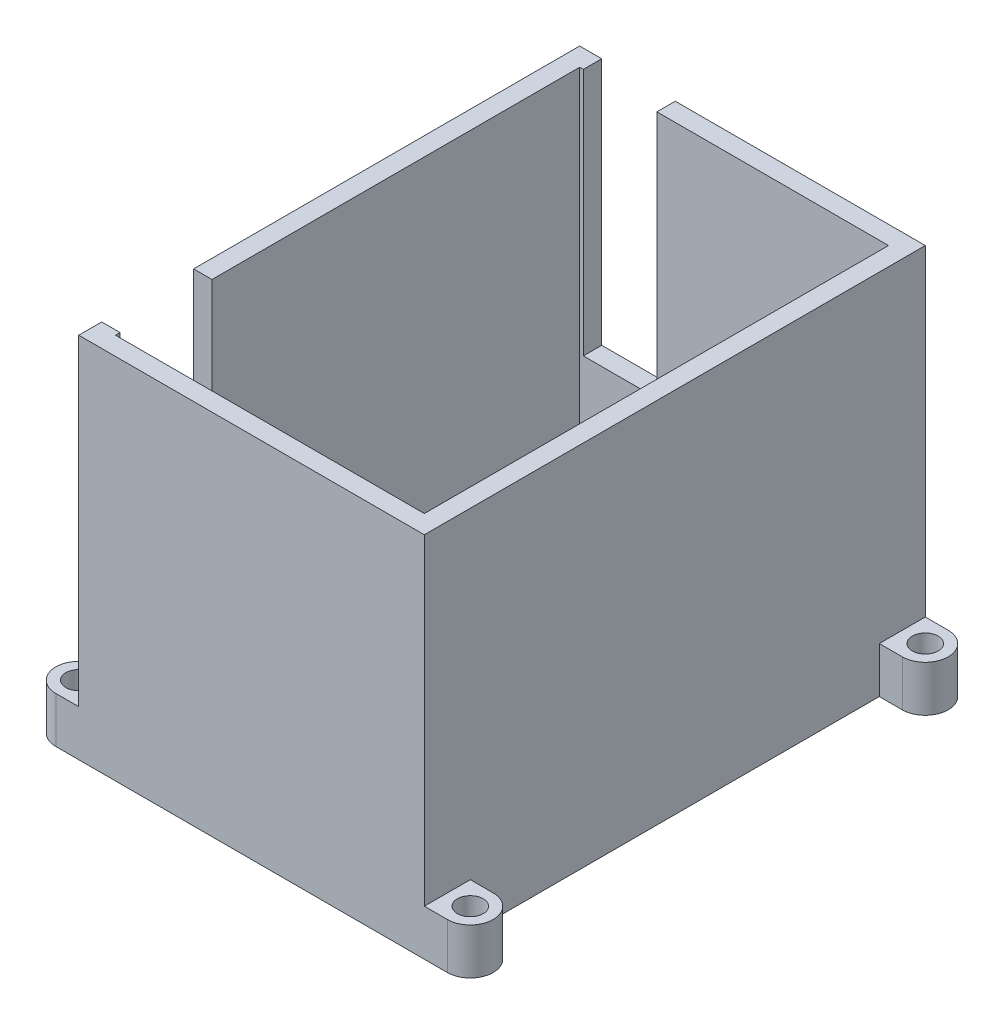
ISO-10303-21;
HEADER;
FILE_DESCRIPTION(('STEP AP214'),'2;1');
FILE_NAME('part.step','',(''),(''),'','','');
FILE_SCHEMA(('AUTOMOTIVE_DESIGN { 1 0 10303 214 1 1 1 1 }'));
ENDSEC;
DATA;
#1=APPLICATION_CONTEXT('core data for automotive mechanical design processes');
#2=APPLICATION_PROTOCOL_DEFINITION('international standard','automotive_design',2000,#1);
#3=PRODUCT_CONTEXT('',#1,'mechanical');
#4=PRODUCT('Part','Part','',(#3));
#5=PRODUCT_RELATED_PRODUCT_CATEGORY('part','',(#4));
#6=PRODUCT_DEFINITION_FORMATION('','',#4);
#7=PRODUCT_DEFINITION_CONTEXT('part definition',#1,'design');
#8=PRODUCT_DEFINITION('design','',#6,#7);
#9=PRODUCT_DEFINITION_SHAPE('','',#8);
#10=(LENGTH_UNIT() NAMED_UNIT(*) SI_UNIT(.MILLI.,.METRE.));
#11=(NAMED_UNIT(*) PLANE_ANGLE_UNIT() SI_UNIT($,.RADIAN.));
#12=(NAMED_UNIT(*) SI_UNIT($,.STERADIAN.) SOLID_ANGLE_UNIT());
#13=UNCERTAINTY_MEASURE_WITH_UNIT(LENGTH_MEASURE(1.E-05),#10,'distance_accuracy_value','');
#14=(GEOMETRIC_REPRESENTATION_CONTEXT(3) GLOBAL_UNCERTAINTY_ASSIGNED_CONTEXT((#13)) GLOBAL_UNIT_ASSIGNED_CONTEXT((#10,
#11,#12)) REPRESENTATION_CONTEXT('',''));
#15=CARTESIAN_POINT('',(0.,0.,0.));
#16=DIRECTION('',(0.,0.,1.));
#17=DIRECTION('',(1.,0.,0.));
#18=AXIS2_PLACEMENT_3D('',#15,#16,#17);
#19=CARTESIAN_POINT('',(0.,50.8,0.));
#20=DIRECTION('',(0.,1.,0.));
#21=DIRECTION('',(0.,0.,1.));
#22=AXIS2_PLACEMENT_3D('',#19,#20,#21);
#23=PLANE('',#22);
#24=DIRECTION('',(0.,0.,-1.));
#25=VECTOR('',#24,1.);
#26=CARTESIAN_POINT('',(0.508000000000002,50.8,-60.325));
#27=LINE('',#26,#25);
#28=CARTESIAN_POINT('',(0.508000000000002,50.8,-64.135));
#29=VERTEX_POINT('',#28);
#30=CARTESIAN_POINT('',(0.508000000000002,50.8,-66.675));
#31=VERTEX_POINT('',#30);
#32=EDGE_CURVE('E219',#29,#31,#27,.T.);
#33=ORIENTED_EDGE('',*,*,#32,.T.);
#34=DIRECTION('',(-1.,0.,0.));
#35=VECTOR('',#34,1.);
#36=CARTESIAN_POINT('',(-2.54,50.8,-66.675));
#37=LINE('',#36,#35);
#38=CARTESIAN_POINT('',(-2.54,50.8,-66.675));
#39=VERTEX_POINT('',#38);
#40=EDGE_CURVE('E232',#31,#39,#37,.T.);
#41=ORIENTED_EDGE('',*,*,#40,.T.);
#42=DIRECTION('',(0.,0.,1.));
#43=VECTOR('',#42,1.);
#44=CARTESIAN_POINT('',(-2.54,50.8,-66.675));
#45=LINE('',#44,#43);
#46=CARTESIAN_POINT('',(-2.53999999999999,50.8,-13.335));
#47=VERTEX_POINT('',#46);
#48=EDGE_CURVE('E497',#39,#47,#45,.T.);
#49=ORIENTED_EDGE('',*,*,#48,.T.);
#50=DIRECTION('',(-1.,0.,0.));
#51=VECTOR('',#50,1.);
#52=CARTESIAN_POINT('',(3.81000000000001,50.8,-13.335));
#53=LINE('',#52,#51);
#54=CARTESIAN_POINT('',(0.,50.8,-13.335));
#55=VERTEX_POINT('',#54);
#56=EDGE_CURVE('E521',#55,#47,#53,.T.);
#57=ORIENTED_EDGE('',*,*,#56,.F.);
#58=DIRECTION('',(0.,0.,1.));
#59=VECTOR('',#58,1.);
#60=CARTESIAN_POINT('',(0.,50.8,0.));
#61=LINE('',#60,#59);
#62=CARTESIAN_POINT('',(0.,50.8,-64.135));
#63=VERTEX_POINT('',#62);
#64=EDGE_CURVE('E612',#63,#55,#61,.T.);
#65=ORIENTED_EDGE('',*,*,#64,.F.);
#66=DIRECTION('',(-1.,0.,0.));
#67=VECTOR('',#66,1.);
#68=CARTESIAN_POINT('',(0.,50.8,-64.135));
#69=LINE('',#68,#67);
#70=EDGE_CURVE('E235',#29,#63,#69,.T.);
#71=ORIENTED_EDGE('',*,*,#70,.F.);
#72=EDGE_LOOP('',(#33,#41,#49,#57,#65,#71));
#73=FACE_BOUND('',#72,.T.);
#74=ADVANCED_FACE('F33',(#73),#23,.T.);
#75=CARTESIAN_POINT('',(45.212,50.8,-66.675));
#76=DIRECTION('',(-1.,0.,0.));
#77=DIRECTION('',(0.,0.,1.));
#78=AXIS2_PLACEMENT_3D('',#75,#76,#77);
#79=PLANE('',#78);
#80=DIRECTION('',(0.,0.,-1.));
#81=VECTOR('',#80,1.);
#82=CARTESIAN_POINT('',(45.212,6.35,-3.81000000000001));
#83=LINE('',#82,#81);
#84=CARTESIAN_POINT('',(45.212,6.34999999999999,2.54));
#85=VERTEX_POINT('',#84);
#86=CARTESIAN_POINT('',(45.212,6.35,-3.81000000000001));
#87=VERTEX_POINT('',#86);
#88=EDGE_CURVE('E405',#85,#87,#83,.T.);
#89=ORIENTED_EDGE('',*,*,#88,.T.);
#90=DIRECTION('',(0.,-1.,0.));
#91=VECTOR('',#90,1.);
#92=CARTESIAN_POINT('',(45.212,6.35,-3.81000000000001));
#93=LINE('',#92,#91);
#94=CARTESIAN_POINT('',(45.212,0.,-3.81000000000001));
#95=VERTEX_POINT('',#94);
#96=EDGE_CURVE('E403',#87,#95,#93,.T.);
#97=ORIENTED_EDGE('',*,*,#96,.T.);
#98=DIRECTION('',(0.,0.,-1.));
#99=VECTOR('',#98,1.);
#100=CARTESIAN_POINT('',(45.212,0.,-66.675));
#101=LINE('',#100,#99);
#102=CARTESIAN_POINT('',(45.212,0.,-60.325));
#103=VERTEX_POINT('',#102);
#104=EDGE_CURVE('E262',#95,#103,#101,.T.);
#105=ORIENTED_EDGE('',*,*,#104,.T.);
#106=DIRECTION('',(0.,-1.,0.));
#107=VECTOR('',#106,1.);
#108=CARTESIAN_POINT('',(45.212,6.35,-60.325));
#109=LINE('',#108,#107);
#110=CARTESIAN_POINT('',(45.212,6.35,-60.325));
#111=VERTEX_POINT('',#110);
#112=EDGE_CURVE('E294',#111,#103,#109,.T.);
#113=ORIENTED_EDGE('',*,*,#112,.F.);
#114=DIRECTION('',(0.,0.,-1.));
#115=VECTOR('',#114,1.);
#116=CARTESIAN_POINT('',(45.212,6.35,-60.325));
#117=LINE('',#116,#115);
#118=CARTESIAN_POINT('',(45.212,6.35,-66.675));
#119=VERTEX_POINT('',#118);
#120=EDGE_CURVE('E287',#111,#119,#117,.T.);
#121=ORIENTED_EDGE('',*,*,#120,.T.);
#122=DIRECTION('',(0.,-1.,0.));
#123=VECTOR('',#122,1.);
#124=CARTESIAN_POINT('',(45.212,50.8,-66.675));
#125=LINE('',#124,#123);
#126=CARTESIAN_POINT('',(45.212,50.8,-66.675));
#127=VERTEX_POINT('',#126);
#128=EDGE_CURVE('E272',#127,#119,#125,.T.);
#129=ORIENTED_EDGE('',*,*,#128,.F.);
#130=DIRECTION('',(0.,0.,-1.));
#131=VECTOR('',#130,1.);
#132=CARTESIAN_POINT('',(45.212,50.8,-66.675));
#133=LINE('',#132,#131);
#134=CARTESIAN_POINT('',(45.212,50.8,2.54));
#135=VERTEX_POINT('',#134);
#136=EDGE_CURVE('E244',#135,#127,#133,.T.);
#137=ORIENTED_EDGE('',*,*,#136,.F.);
#138=DIRECTION('',(0.,-1.,0.));
#139=VECTOR('',#138,1.);
#140=CARTESIAN_POINT('',(45.212,50.8,2.54));
#141=LINE('',#140,#139);
#142=EDGE_CURVE('E275',#135,#85,#141,.T.);
#143=ORIENTED_EDGE('',*,*,#142,.T.);
#144=EDGE_LOOP('',(#89,#97,#105,#113,#121,#129,#137,#143));
#145=FACE_BOUND('',#144,.T.);
#146=ADVANCED_FACE('F400',(#145),#79,.F.);
#147=CARTESIAN_POINT('',(-2.54,50.8,-66.675));
#148=DIRECTION('',(1.,0.,0.));
#149=DIRECTION('',(0.,0.,-1.));
#150=AXIS2_PLACEMENT_3D('',#147,#148,#149);
#151=PLANE('',#150);
#152=DIRECTION('',(0.,0.,1.));
#153=VECTOR('',#152,1.);
#154=CARTESIAN_POINT('',(-2.53999999999999,14.605,-13.335));
#155=LINE('',#154,#153);
#156=CARTESIAN_POINT('',(-2.53999999999999,14.605,-13.335));
#157=VERTEX_POINT('',#156);
#158=CARTESIAN_POINT('',(-2.53999999999999,14.605,-0.634999999999995));
#159=VERTEX_POINT('',#158);
#160=EDGE_CURVE('E516',#157,#159,#155,.T.);
#161=ORIENTED_EDGE('',*,*,#160,.F.);
#162=DIRECTION('',(0.,-1.,0.));
#163=VECTOR('',#162,1.);
#164=CARTESIAN_POINT('',(-2.53999999999999,50.8,-13.335));
#165=LINE('',#164,#163);
#166=EDGE_CURVE('E512',#47,#157,#165,.T.);
#167=ORIENTED_EDGE('',*,*,#166,.F.);
#168=ORIENTED_EDGE('',*,*,#48,.F.);
#169=DIRECTION('',(0.,-1.,0.));
#170=VECTOR('',#169,1.);
#171=CARTESIAN_POINT('',(-2.54,50.8,-66.675));
#172=LINE('',#171,#170);
#173=CARTESIAN_POINT('',(-2.54,6.34999999999999,-66.675));
#174=VERTEX_POINT('',#173);
#175=EDGE_CURVE('E241',#39,#174,#172,.T.);
#176=ORIENTED_EDGE('',*,*,#175,.T.);
#177=DIRECTION('',(0.,0.,1.));
#178=VECTOR('',#177,1.);
#179=CARTESIAN_POINT('',(-2.54,6.35,-60.325));
#180=LINE('',#179,#178);
#181=CARTESIAN_POINT('',(-2.54,6.35,-60.325));
#182=VERTEX_POINT('',#181);
#183=EDGE_CURVE('E418',#174,#182,#180,.T.);
#184=ORIENTED_EDGE('',*,*,#183,.T.);
#185=DIRECTION('',(0.,-1.,0.));
#186=VECTOR('',#185,1.);
#187=CARTESIAN_POINT('',(-2.54,6.35,-60.325));
#188=LINE('',#187,#186);
#189=CARTESIAN_POINT('',(-2.54,0.,-60.325));
#190=VERTEX_POINT('',#189);
#191=EDGE_CURVE('E357',#182,#190,#188,.T.);
#192=ORIENTED_EDGE('',*,*,#191,.T.);
#193=DIRECTION('',(0.,0.,1.));
#194=VECTOR('',#193,1.);
#195=CARTESIAN_POINT('',(-2.54,0.,-66.675));
#196=LINE('',#195,#194);
#197=CARTESIAN_POINT('',(-2.54,0.,-3.81));
#198=VERTEX_POINT('',#197);
#199=EDGE_CURVE('E256',#190,#198,#196,.T.);
#200=ORIENTED_EDGE('',*,*,#199,.T.);
#201=DIRECTION('',(0.,-1.,0.));
#202=VECTOR('',#201,1.);
#203=CARTESIAN_POINT('',(-2.54,6.35,-3.81));
#204=LINE('',#203,#202);
#205=CARTESIAN_POINT('',(-2.54,6.35,-3.81));
#206=VERTEX_POINT('',#205);
#207=EDGE_CURVE('E328',#206,#198,#204,.T.);
#208=ORIENTED_EDGE('',*,*,#207,.F.);
#209=DIRECTION('',(0.,0.,1.));
#210=VECTOR('',#209,1.);
#211=CARTESIAN_POINT('',(-2.54,6.35,-3.81));
#212=LINE('',#211,#210);
#213=CARTESIAN_POINT('',(-2.53999999999999,6.35,2.54));
#214=VERTEX_POINT('',#213);
#215=EDGE_CURVE('E317',#206,#214,#212,.T.);
#216=ORIENTED_EDGE('',*,*,#215,.T.);
#217=DIRECTION('',(0.,-1.,0.));
#218=VECTOR('',#217,1.);
#219=CARTESIAN_POINT('',(-2.53999999999999,50.8,2.54));
#220=LINE('',#219,#218);
#221=CARTESIAN_POINT('',(-2.53999999999999,50.8,2.54));
#222=VERTEX_POINT('',#221);
#223=EDGE_CURVE('E507',#222,#214,#220,.T.);
#224=ORIENTED_EDGE('',*,*,#223,.F.);
#225=CARTESIAN_POINT('',(-2.53999999999999,50.8,-0.635));
#226=VERTEX_POINT('',#225);
#227=EDGE_CURVE('E270',#226,#222,#45,.T.);
#228=ORIENTED_EDGE('',*,*,#227,.F.);
#229=DIRECTION('',(0.,1.,0.));
#230=VECTOR('',#229,1.);
#231=CARTESIAN_POINT('',(-2.53999999999999,50.8,-0.635));
#232=LINE('',#231,#230);
#233=EDGE_CURVE('E518',#159,#226,#232,.T.);
#234=ORIENTED_EDGE('',*,*,#233,.F.);
#235=EDGE_LOOP('',(#161,#167,#168,#176,#184,#192,#200,#208,#216,#224,#228,#234));
#236=FACE_BOUND('',#235,.T.);
#237=ADVANCED_FACE('F35',(#236),#151,.F.);
#238=DIRECTION('',(0.,0.,-1.));
#239=VECTOR('',#238,1.);
#240=CARTESIAN_POINT('',(10.668,50.8,-60.325));
#241=LINE('',#240,#239);
#242=CARTESIAN_POINT('',(10.668,50.8,-64.135));
#243=VERTEX_POINT('',#242);
#244=CARTESIAN_POINT('',(10.668,50.8,-66.675));
#245=VERTEX_POINT('',#244);
#246=EDGE_CURVE('E236',#243,#245,#241,.T.);
#247=ORIENTED_EDGE('',*,*,#246,.F.);
#248=CARTESIAN_POINT('',(42.672,50.8,-64.135));
#249=VERTEX_POINT('',#248);
#250=EDGE_CURVE('E459',#249,#243,#69,.T.);
#251=ORIENTED_EDGE('',*,*,#250,.F.);
#252=DIRECTION('',(0.,0.,-1.));
#253=VECTOR('',#252,1.);
#254=CARTESIAN_POINT('',(42.672,50.8,0.));
#255=LINE('',#254,#253);
#256=CARTESIAN_POINT('',(42.672,50.8,0.));
#257=VERTEX_POINT('',#256);
#258=EDGE_CURVE('E475',#257,#249,#255,.T.);
#259=ORIENTED_EDGE('',*,*,#258,.F.);
#260=DIRECTION('',(1.,0.,0.));
#261=VECTOR('',#260,1.);
#262=CARTESIAN_POINT('',(0.,50.8,0.));
#263=LINE('',#262,#261);
#264=CARTESIAN_POINT('',(0.,50.8,0.));
#265=VERTEX_POINT('',#264);
#266=EDGE_CURVE('E614',#265,#257,#263,.T.);
#267=ORIENTED_EDGE('',*,*,#266,.F.);
#268=CARTESIAN_POINT('',(0.,50.8,-0.635));
#269=VERTEX_POINT('',#268);
#270=EDGE_CURVE('E490',#269,#265,#61,.T.);
#271=ORIENTED_EDGE('',*,*,#270,.F.);
#272=DIRECTION('',(-1.,0.,0.));
#273=VECTOR('',#272,1.);
#274=CARTESIAN_POINT('',(3.81000000000001,50.8,-0.635000000000001));
#275=LINE('',#274,#273);
#276=EDGE_CURVE('E524',#269,#226,#275,.T.);
#277=ORIENTED_EDGE('',*,*,#276,.T.);
#278=ORIENTED_EDGE('',*,*,#227,.T.);
#279=DIRECTION('',(1.,0.,0.));
#280=VECTOR('',#279,1.);
#281=CARTESIAN_POINT('',(-2.53999999999999,50.8,2.54));
#282=LINE('',#281,#280);
#283=EDGE_CURVE('E247',#222,#135,#282,.T.);
#284=ORIENTED_EDGE('',*,*,#283,.T.);
#285=ORIENTED_EDGE('',*,*,#136,.T.);
#286=EDGE_CURVE('E243',#127,#245,#37,.T.);
#287=ORIENTED_EDGE('',*,*,#286,.T.);
#288=EDGE_LOOP('',(#247,#251,#259,#267,#271,#277,#278,#284,#285,#287));
#289=FACE_BOUND('',#288,.T.);
#290=ADVANCED_FACE('F440',(#289),#23,.T.);
#291=CARTESIAN_POINT('',(0.,0.,0.));
#292=DIRECTION('',(0.,1.,0.));
#293=DIRECTION('',(0.,0.,1.));
#294=AXIS2_PLACEMENT_3D('',#291,#292,#293);
#295=PLANE('',#294);
#296=CARTESIAN_POINT('',(-5.715,0.,-0.635));
#297=DIRECTION('',(0.,1.,0.));
#298=DIRECTION('',(0.,0.,1.));
#299=AXIS2_PLACEMENT_3D('',#296,#297,#298);
#300=CIRCLE('',#299,1.786001);
#301=CARTESIAN_POINT('',(-5.715,0.,1.151001));
#302=VERTEX_POINT('',#301);
#303=EDGE_CURVE('E530',#302,#302,#300,.T.);
#304=ORIENTED_EDGE('',*,*,#303,.T.);
#305=EDGE_LOOP('',(#304));
#306=FACE_BOUND('',#305,.T.);
#307=CARTESIAN_POINT('',(-5.715,0.,-63.5));
#308=DIRECTION('',(0.,1.,0.));
#309=DIRECTION('',(0.,0.,1.));
#310=AXIS2_PLACEMENT_3D('',#307,#308,#309);
#311=CIRCLE('',#310,1.786001);
#312=CARTESIAN_POINT('',(-5.715,0.,-61.713999));
#313=VERTEX_POINT('',#312);
#314=EDGE_CURVE('E534',#313,#313,#311,.T.);
#315=ORIENTED_EDGE('',*,*,#314,.T.);
#316=EDGE_LOOP('',(#315));
#317=FACE_BOUND('',#316,.T.);
#318=CARTESIAN_POINT('',(48.387,0.,-63.5));
#319=DIRECTION('',(0.,1.,0.));
#320=DIRECTION('',(0.,0.,1.));
#321=AXIS2_PLACEMENT_3D('',#318,#319,#320);
#322=CIRCLE('',#321,1.786001);
#323=CARTESIAN_POINT('',(48.387,0.,-61.713999));
#324=VERTEX_POINT('',#323);
#325=EDGE_CURVE('E538',#324,#324,#322,.T.);
#326=ORIENTED_EDGE('',*,*,#325,.T.);
#327=EDGE_LOOP('',(#326));
#328=FACE_BOUND('',#327,.T.);
#329=CARTESIAN_POINT('',(48.387,0.,-0.635000000000008));
#330=DIRECTION('',(0.,1.,0.));
#331=DIRECTION('',(0.,0.,1.));
#332=AXIS2_PLACEMENT_3D('',#329,#330,#331);
#333=CIRCLE('',#332,1.786001);
#334=CARTESIAN_POINT('',(48.387,0.,1.15100099999999));
#335=VERTEX_POINT('',#334);
#336=EDGE_CURVE('E265',#335,#335,#333,.T.);
#337=ORIENTED_EDGE('',*,*,#336,.T.);
#338=EDGE_LOOP('',(#337));
#339=FACE_BOUND('',#338,.T.);
#340=ORIENTED_EDGE('',*,*,#199,.F.);
#341=DIRECTION('',(-1.,0.,0.));
#342=VECTOR('',#341,1.);
#343=CARTESIAN_POINT('',(-5.715,0.,-60.325));
#344=LINE('',#343,#342);
#345=CARTESIAN_POINT('',(-5.715,0.,-60.325));
#346=VERTEX_POINT('',#345);
#347=EDGE_CURVE('E361',#190,#346,#344,.T.);
#348=ORIENTED_EDGE('',*,*,#347,.T.);
#349=CARTESIAN_POINT('',(-5.715,0.,-63.5));
#350=DIRECTION('',(0.,-1.,0.));
#351=DIRECTION('',(0.,0.,1.));
#352=AXIS2_PLACEMENT_3D('',#349,#350,#351);
#353=CIRCLE('',#352,3.175);
#354=CARTESIAN_POINT('',(-5.715,0.,-66.675));
#355=VERTEX_POINT('',#354);
#356=EDGE_CURVE('E368',#346,#355,#353,.T.);
#357=ORIENTED_EDGE('',*,*,#356,.T.);
#358=DIRECTION('',(-1.,0.,0.));
#359=VECTOR('',#358,1.);
#360=CARTESIAN_POINT('',(-2.54,0.,-66.675));
#361=LINE('',#360,#359);
#362=CARTESIAN_POINT('',(48.387,0.,-66.675));
#363=VERTEX_POINT('',#362);
#364=EDGE_CURVE('E264',#363,#355,#361,.T.);
#365=ORIENTED_EDGE('',*,*,#364,.F.);
#366=CARTESIAN_POINT('',(48.387,0.,-63.5));
#367=DIRECTION('',(0.,-1.,0.));
#368=DIRECTION('',(0.,0.,-1.));
#369=AXIS2_PLACEMENT_3D('',#366,#367,#368);
#370=CIRCLE('',#369,3.175);
#371=CARTESIAN_POINT('',(48.387,0.,-60.325));
#372=VERTEX_POINT('',#371);
#373=EDGE_CURVE('E300',#363,#372,#370,.T.);
#374=ORIENTED_EDGE('',*,*,#373,.T.);
#375=DIRECTION('',(-1.,0.,0.));
#376=VECTOR('',#375,1.);
#377=CARTESIAN_POINT('',(48.387,0.,-60.325));
#378=LINE('',#377,#376);
#379=EDGE_CURVE('E303',#372,#103,#378,.T.);
#380=ORIENTED_EDGE('',*,*,#379,.T.);
#381=ORIENTED_EDGE('',*,*,#104,.F.);
#382=DIRECTION('',(1.,0.,0.));
#383=VECTOR('',#382,1.);
#384=CARTESIAN_POINT('',(48.387,0.,-3.81000000000001));
#385=LINE('',#384,#383);
#386=CARTESIAN_POINT('',(48.387,0.,-3.81000000000001));
#387=VERTEX_POINT('',#386);
#388=EDGE_CURVE('E545',#95,#387,#385,.T.);
#389=ORIENTED_EDGE('',*,*,#388,.T.);
#390=CARTESIAN_POINT('',(48.387,0.,-0.635000000000008));
#391=DIRECTION('',(0.,-1.,0.));
#392=DIRECTION('',(0.,0.,1.));
#393=AXIS2_PLACEMENT_3D('',#390,#391,#392);
#394=CIRCLE('',#393,3.175);
#395=CARTESIAN_POINT('',(48.387,0.,2.53999999999999));
#396=VERTEX_POINT('',#395);
#397=EDGE_CURVE('E549',#387,#396,#394,.T.);
#398=ORIENTED_EDGE('',*,*,#397,.T.);
#399=DIRECTION('',(1.,0.,0.));
#400=VECTOR('',#399,1.);
#401=CARTESIAN_POINT('',(-2.53999999999999,0.,2.54));
#402=LINE('',#401,#400);
#403=CARTESIAN_POINT('',(-5.715,0.,2.54));
#404=VERTEX_POINT('',#403);
#405=EDGE_CURVE('E253',#404,#396,#402,.T.);
#406=ORIENTED_EDGE('',*,*,#405,.F.);
#407=CARTESIAN_POINT('',(-5.715,0.,-0.635));
#408=DIRECTION('',(0.,-1.,0.));
#409=DIRECTION('',(0.,0.,-1.));
#410=AXIS2_PLACEMENT_3D('',#407,#408,#409);
#411=CIRCLE('',#410,3.175);
#412=CARTESIAN_POINT('',(-5.715,0.,-3.81));
#413=VERTEX_POINT('',#412);
#414=EDGE_CURVE('E308',#404,#413,#411,.T.);
#415=ORIENTED_EDGE('',*,*,#414,.T.);
#416=DIRECTION('',(1.,0.,0.));
#417=VECTOR('',#416,1.);
#418=CARTESIAN_POINT('',(-5.715,0.,-3.81));
#419=LINE('',#418,#417);
#420=EDGE_CURVE('E314',#413,#198,#419,.T.);
#421=ORIENTED_EDGE('',*,*,#420,.T.);
#422=EDGE_LOOP('',(#340,#348,#357,#365,#374,#380,#381,#389,#398,#406,#415,#421));
#423=FACE_BOUND('',#422,.T.);
#424=DIRECTION('',(0.,0.,1.));
#425=VECTOR('',#424,1.);
#426=CARTESIAN_POINT('',(0.,0.,0.));
#427=LINE('',#426,#425);
#428=CARTESIAN_POINT('',(0.,0.,-64.135));
#429=VERTEX_POINT('',#428);
#430=CARTESIAN_POINT('',(0.,0.,0.));
#431=VERTEX_POINT('',#430);
#432=EDGE_CURVE('E479',#429,#431,#427,.T.);
#433=ORIENTED_EDGE('',*,*,#432,.T.);
#434=DIRECTION('',(1.,0.,0.));
#435=VECTOR('',#434,1.);
#436=CARTESIAN_POINT('',(0.,0.,0.));
#437=LINE('',#436,#435);
#438=CARTESIAN_POINT('',(42.672,0.,0.));
#439=VERTEX_POINT('',#438);
#440=EDGE_CURVE('E482',#431,#439,#437,.T.);
#441=ORIENTED_EDGE('',*,*,#440,.T.);
#442=DIRECTION('',(0.,0.,-1.));
#443=VECTOR('',#442,1.);
#444=CARTESIAN_POINT('',(42.672,0.,0.));
#445=LINE('',#444,#443);
#446=CARTESIAN_POINT('',(42.672,0.,-64.135));
#447=VERTEX_POINT('',#446);
#448=EDGE_CURVE('E485',#439,#447,#445,.T.);
#449=ORIENTED_EDGE('',*,*,#448,.T.);
#450=DIRECTION('',(-1.,0.,0.));
#451=VECTOR('',#450,1.);
#452=CARTESIAN_POINT('',(0.,0.,-64.135));
#453=LINE('',#452,#451);
#454=EDGE_CURVE('E488',#447,#429,#453,.T.);
#455=ORIENTED_EDGE('',*,*,#454,.T.);
#456=EDGE_LOOP('',(#433,#441,#449,#455));
#457=FACE_BOUND('',#456,.T.);
#458=ADVANCED_FACE('F340',(#306,#317,#328,#339,#423,#457),#295,.F.);
#459=CARTESIAN_POINT('',(-2.53999999999999,50.8,2.54));
#460=DIRECTION('',(0.,0.,-1.));
#461=DIRECTION('',(-1.,0.,0.));
#462=AXIS2_PLACEMENT_3D('',#459,#460,#461);
#463=PLANE('',#462);
#464=ORIENTED_EDGE('',*,*,#405,.T.);
#465=DIRECTION('',(0.,-1.,0.));
#466=VECTOR('',#465,1.);
#467=CARTESIAN_POINT('',(48.387,6.35,2.53999999999999));
#468=LINE('',#467,#466);
#469=CARTESIAN_POINT('',(48.387,6.35,2.53999999999999));
#470=VERTEX_POINT('',#469);
#471=EDGE_CURVE('E409',#470,#396,#468,.T.);
#472=ORIENTED_EDGE('',*,*,#471,.F.);
#473=DIRECTION('',(-1.,0.,0.));
#474=VECTOR('',#473,1.);
#475=CARTESIAN_POINT('',(45.212,6.35,2.53999999999999));
#476=LINE('',#475,#474);
#477=EDGE_CURVE('E506',#470,#85,#476,.T.);
#478=ORIENTED_EDGE('',*,*,#477,.T.);
#479=ORIENTED_EDGE('',*,*,#142,.F.);
#480=ORIENTED_EDGE('',*,*,#283,.F.);
#481=ORIENTED_EDGE('',*,*,#223,.T.);
#482=DIRECTION('',(-1.,0.,0.));
#483=VECTOR('',#482,1.);
#484=CARTESIAN_POINT('',(-2.54,6.35,2.54));
#485=LINE('',#484,#483);
#486=CARTESIAN_POINT('',(-5.715,6.35,2.54));
#487=VERTEX_POINT('',#486);
#488=EDGE_CURVE('E325',#214,#487,#485,.T.);
#489=ORIENTED_EDGE('',*,*,#488,.T.);
#490=DIRECTION('',(0.,-1.,0.));
#491=VECTOR('',#490,1.);
#492=CARTESIAN_POINT('',(-5.715,6.35,2.54));
#493=LINE('',#492,#491);
#494=EDGE_CURVE('E331',#487,#404,#493,.T.);
#495=ORIENTED_EDGE('',*,*,#494,.T.);
#496=EDGE_LOOP('',(#464,#472,#478,#479,#480,#481,#489,#495));
#497=FACE_BOUND('',#496,.T.);
#498=ADVANCED_FACE('F453',(#497),#463,.F.);
#499=CARTESIAN_POINT('',(-2.54,50.8,-66.675));
#500=DIRECTION('',(0.,0.,1.));
#501=DIRECTION('',(1.,0.,0.));
#502=AXIS2_PLACEMENT_3D('',#499,#500,#501);
#503=PLANE('',#502);
#504=ORIENTED_EDGE('',*,*,#40,.F.);
#505=DIRECTION('',(0.,1.,0.));
#506=VECTOR('',#505,1.);
#507=CARTESIAN_POINT('',(0.508000000000002,50.8,-66.675));
#508=LINE('',#507,#506);
#509=CARTESIAN_POINT('',(0.507999999999995,16.51,-66.675));
#510=VERTEX_POINT('',#509);
#511=EDGE_CURVE('E216',#510,#31,#508,.T.);
#512=ORIENTED_EDGE('',*,*,#511,.F.);
#513=DIRECTION('',(-1.,0.,0.));
#514=VECTOR('',#513,1.);
#515=CARTESIAN_POINT('',(0.507999999999995,16.51,-66.675));
#516=LINE('',#515,#514);
#517=CARTESIAN_POINT('',(10.668,16.51,-66.675));
#518=VERTEX_POINT('',#517);
#519=EDGE_CURVE('E237',#518,#510,#516,.T.);
#520=ORIENTED_EDGE('',*,*,#519,.F.);
#521=DIRECTION('',(0.,-1.,0.));
#522=VECTOR('',#521,1.);
#523=CARTESIAN_POINT('',(10.668,50.8,-66.675));
#524=LINE('',#523,#522);
#525=EDGE_CURVE('E227',#245,#518,#524,.T.);
#526=ORIENTED_EDGE('',*,*,#525,.F.);
#527=ORIENTED_EDGE('',*,*,#286,.F.);
#528=ORIENTED_EDGE('',*,*,#128,.T.);
#529=DIRECTION('',(1.,0.,0.));
#530=VECTOR('',#529,1.);
#531=CARTESIAN_POINT('',(45.212,6.35,-66.675));
#532=LINE('',#531,#530);
#533=CARTESIAN_POINT('',(48.387,6.35,-66.675));
#534=VERTEX_POINT('',#533);
#535=EDGE_CURVE('E283',#119,#534,#532,.T.);
#536=ORIENTED_EDGE('',*,*,#535,.T.);
#537=DIRECTION('',(0.,-1.,0.));
#538=VECTOR('',#537,1.);
#539=CARTESIAN_POINT('',(48.387,6.35,-66.675));
#540=LINE('',#539,#538);
#541=EDGE_CURVE('E305',#534,#363,#540,.T.);
#542=ORIENTED_EDGE('',*,*,#541,.T.);
#543=ORIENTED_EDGE('',*,*,#364,.T.);
#544=DIRECTION('',(0.,-1.,0.));
#545=VECTOR('',#544,1.);
#546=CARTESIAN_POINT('',(-5.715,6.35,-66.675));
#547=LINE('',#546,#545);
#548=CARTESIAN_POINT('',(-5.715,6.35,-66.675));
#549=VERTEX_POINT('',#548);
#550=EDGE_CURVE('E379',#549,#355,#547,.T.);
#551=ORIENTED_EDGE('',*,*,#550,.F.);
#552=DIRECTION('',(1.,0.,0.));
#553=VECTOR('',#552,1.);
#554=CARTESIAN_POINT('',(-2.54,6.35,-66.675));
#555=LINE('',#554,#553);
#556=EDGE_CURVE('E371',#549,#174,#555,.T.);
#557=ORIENTED_EDGE('',*,*,#556,.T.);
#558=ORIENTED_EDGE('',*,*,#175,.F.);
#559=EDGE_LOOP('',(#504,#512,#520,#526,#527,#528,#536,#542,#543,#551,#557,#558));
#560=FACE_BOUND('',#559,.T.);
#561=ADVANCED_FACE('F239',(#560),#503,.F.);
#562=CARTESIAN_POINT('',(0.,50.8,0.));
#563=DIRECTION('',(1.,0.,0.));
#564=DIRECTION('',(0.,0.,-1.));
#565=AXIS2_PLACEMENT_3D('',#562,#563,#564);
#566=PLANE('',#565);
#567=DIRECTION('',(0.,1.,0.));
#568=VECTOR('',#567,1.);
#569=CARTESIAN_POINT('',(0.,50.8,-13.335));
#570=LINE('',#569,#568);
#571=CARTESIAN_POINT('',(0.,14.605,-13.335));
#572=VERTEX_POINT('',#571);
#573=EDGE_CURVE('E603',#572,#55,#570,.T.);
#574=ORIENTED_EDGE('',*,*,#573,.F.);
#575=DIRECTION('',(0.,0.,-1.));
#576=VECTOR('',#575,1.);
#577=CARTESIAN_POINT('',(0.,14.605,0.));
#578=LINE('',#577,#576);
#579=CARTESIAN_POINT('',(0.,14.605,-0.634999999999995));
#580=VERTEX_POINT('',#579);
#581=EDGE_CURVE('E599',#580,#572,#578,.T.);
#582=ORIENTED_EDGE('',*,*,#581,.F.);
#583=DIRECTION('',(0.,-1.,0.));
#584=VECTOR('',#583,1.);
#585=CARTESIAN_POINT('',(0.,50.8,-0.635));
#586=LINE('',#585,#584);
#587=EDGE_CURVE('E601',#269,#580,#586,.T.);
#588=ORIENTED_EDGE('',*,*,#587,.F.);
#589=ORIENTED_EDGE('',*,*,#270,.T.);
#590=DIRECTION('',(0.,-1.,0.));
#591=VECTOR('',#590,1.);
#592=CARTESIAN_POINT('',(0.,50.8,0.));
#593=LINE('',#592,#591);
#594=EDGE_CURVE('E259',#265,#431,#593,.T.);
#595=ORIENTED_EDGE('',*,*,#594,.T.);
#596=ORIENTED_EDGE('',*,*,#432,.F.);
#597=DIRECTION('',(0.,-1.,0.));
#598=VECTOR('',#597,1.);
#599=CARTESIAN_POINT('',(0.,50.8,-64.135));
#600=LINE('',#599,#598);
#601=EDGE_CURVE('E471',#63,#429,#600,.T.);
#602=ORIENTED_EDGE('',*,*,#601,.F.);
#603=ORIENTED_EDGE('',*,*,#64,.T.);
#604=EDGE_LOOP('',(#574,#582,#588,#589,#595,#596,#602,#603));
#605=FACE_BOUND('',#604,.T.);
#606=ADVANCED_FACE('F611',(#605),#566,.T.);
#607=CARTESIAN_POINT('',(0.,50.8,0.));
#608=DIRECTION('',(0.,0.,-1.));
#609=DIRECTION('',(-1.,0.,0.));
#610=AXIS2_PLACEMENT_3D('',#607,#608,#609);
#611=PLANE('',#610);
#612=ORIENTED_EDGE('',*,*,#440,.F.);
#613=ORIENTED_EDGE('',*,*,#594,.F.);
#614=ORIENTED_EDGE('',*,*,#266,.T.);
#615=DIRECTION('',(0.,-1.,0.));
#616=VECTOR('',#615,1.);
#617=CARTESIAN_POINT('',(42.672,50.8,0.));
#618=LINE('',#617,#616);
#619=EDGE_CURVE('E493',#257,#439,#618,.T.);
#620=ORIENTED_EDGE('',*,*,#619,.T.);
#621=EDGE_LOOP('',(#612,#613,#614,#620));
#622=FACE_BOUND('',#621,.T.);
#623=ADVANCED_FACE('F630',(#622),#611,.T.);
#624=CARTESIAN_POINT('',(42.672,50.8,0.));
#625=DIRECTION('',(-1.,0.,0.));
#626=DIRECTION('',(0.,0.,1.));
#627=AXIS2_PLACEMENT_3D('',#624,#625,#626);
#628=PLANE('',#627);
#629=ORIENTED_EDGE('',*,*,#448,.F.);
#630=ORIENTED_EDGE('',*,*,#619,.F.);
#631=ORIENTED_EDGE('',*,*,#258,.T.);
#632=DIRECTION('',(0.,-1.,0.));
#633=VECTOR('',#632,1.);
#634=CARTESIAN_POINT('',(42.672,50.8,-64.135));
#635=LINE('',#634,#633);
#636=EDGE_CURVE('E469',#249,#447,#635,.T.);
#637=ORIENTED_EDGE('',*,*,#636,.T.);
#638=EDGE_LOOP('',(#629,#630,#631,#637));
#639=FACE_BOUND('',#638,.T.);
#640=ADVANCED_FACE('F634',(#639),#628,.T.);
#641=CARTESIAN_POINT('',(0.,50.8,-64.135));
#642=DIRECTION('',(0.,0.,1.));
#643=DIRECTION('',(1.,0.,0.));
#644=AXIS2_PLACEMENT_3D('',#641,#642,#643);
#645=PLANE('',#644);
#646=DIRECTION('',(0.,-1.,0.));
#647=VECTOR('',#646,1.);
#648=CARTESIAN_POINT('',(0.508000000000002,50.8,-64.135));
#649=LINE('',#648,#647);
#650=CARTESIAN_POINT('',(0.507999999999995,16.51,-64.135));
#651=VERTEX_POINT('',#650);
#652=EDGE_CURVE('E11',#29,#651,#649,.T.);
#653=ORIENTED_EDGE('',*,*,#652,.F.);
#654=ORIENTED_EDGE('',*,*,#70,.T.);
#655=ORIENTED_EDGE('',*,*,#601,.T.);
#656=ORIENTED_EDGE('',*,*,#454,.F.);
#657=ORIENTED_EDGE('',*,*,#636,.F.);
#658=ORIENTED_EDGE('',*,*,#250,.T.);
#659=DIRECTION('',(0.,1.,0.));
#660=VECTOR('',#659,1.);
#661=CARTESIAN_POINT('',(10.668,50.8,-64.135));
#662=LINE('',#661,#660);
#663=CARTESIAN_POINT('',(10.668,16.51,-64.135));
#664=VERTEX_POINT('',#663);
#665=EDGE_CURVE('E467',#664,#243,#662,.T.);
#666=ORIENTED_EDGE('',*,*,#665,.F.);
#667=DIRECTION('',(1.,0.,0.));
#668=VECTOR('',#667,1.);
#669=CARTESIAN_POINT('',(0.,16.51,-64.135));
#670=LINE('',#669,#668);
#671=EDGE_CURVE('E41',#651,#664,#670,.T.);
#672=ORIENTED_EDGE('',*,*,#671,.F.);
#673=EDGE_LOOP('',(#653,#654,#655,#656,#657,#658,#666,#672));
#674=FACE_BOUND('',#673,.T.);
#675=ADVANCED_FACE('F465',(#674),#645,.T.);
#676=CARTESIAN_POINT('',(-5.715,6.35,-0.635));
#677=DIRECTION('',(0.,-1.,0.));
#678=DIRECTION('',(0.,0.,-1.));
#679=AXIS2_PLACEMENT_3D('',#676,#677,#678);
#680=CYLINDRICAL_SURFACE('',#679,3.175);
#681=ORIENTED_EDGE('',*,*,#414,.F.);
#682=ORIENTED_EDGE('',*,*,#494,.F.);
#683=CARTESIAN_POINT('',(-5.715,6.35,-0.635));
#684=DIRECTION('',(0.,-1.,0.));
#685=DIRECTION('',(0.,0.,-1.));
#686=AXIS2_PLACEMENT_3D('',#683,#684,#685);
#687=CIRCLE('',#686,3.175);
#688=CARTESIAN_POINT('',(-5.715,6.35,-3.81));
#689=VERTEX_POINT('',#688);
#690=EDGE_CURVE('E310',#487,#689,#687,.T.);
#691=ORIENTED_EDGE('',*,*,#690,.T.);
#692=DIRECTION('',(0.,-1.,0.));
#693=VECTOR('',#692,1.);
#694=CARTESIAN_POINT('',(-5.715,6.35,-3.81));
#695=LINE('',#694,#693);
#696=EDGE_CURVE('E332',#689,#413,#695,.T.);
#697=ORIENTED_EDGE('',*,*,#696,.T.);
#698=EDGE_LOOP('',(#681,#682,#691,#697));
#699=FACE_BOUND('',#698,.T.);
#700=ADVANCED_FACE('F345',(#699),#680,.T.);
#701=CARTESIAN_POINT('',(-5.715,6.35,-3.81));
#702=DIRECTION('',(0.,0.,-1.));
#703=DIRECTION('',(-1.,0.,0.));
#704=AXIS2_PLACEMENT_3D('',#701,#702,#703);
#705=PLANE('',#704);
#706=ORIENTED_EDGE('',*,*,#420,.F.);
#707=ORIENTED_EDGE('',*,*,#696,.F.);
#708=DIRECTION('',(1.,0.,0.));
#709=VECTOR('',#708,1.);
#710=CARTESIAN_POINT('',(-5.715,6.35,-3.81));
#711=LINE('',#710,#709);
#712=EDGE_CURVE('E313',#689,#206,#711,.T.);
#713=ORIENTED_EDGE('',*,*,#712,.T.);
#714=ORIENTED_EDGE('',*,*,#207,.T.);
#715=EDGE_LOOP('',(#706,#707,#713,#714));
#716=FACE_BOUND('',#715,.T.);
#717=ADVANCED_FACE('F350',(#716),#705,.T.);
#718=CARTESIAN_POINT('',(-5.715,6.35,-0.635));
#719=DIRECTION('',(0.,-1.,0.));
#720=DIRECTION('',(0.,0.,-1.));
#721=AXIS2_PLACEMENT_3D('',#718,#719,#720);
#722=PLANE('',#721);
#723=CARTESIAN_POINT('',(-5.715,6.35,-0.635));
#724=DIRECTION('',(0.,1.,0.));
#725=DIRECTION('',(0.,0.,1.));
#726=AXIS2_PLACEMENT_3D('',#723,#724,#725);
#727=CIRCLE('',#726,1.786001);
#728=CARTESIAN_POINT('',(-5.715,6.35,1.151001));
#729=VERTEX_POINT('',#728);
#730=EDGE_CURVE('E523',#729,#729,#727,.T.);
#731=ORIENTED_EDGE('',*,*,#730,.F.);
#732=EDGE_LOOP('',(#731));
#733=FACE_BOUND('',#732,.T.);
#734=ORIENTED_EDGE('',*,*,#690,.F.);
#735=ORIENTED_EDGE('',*,*,#488,.F.);
#736=ORIENTED_EDGE('',*,*,#215,.F.);
#737=ORIENTED_EDGE('',*,*,#712,.F.);
#738=EDGE_LOOP('',(#734,#735,#736,#737));
#739=FACE_BOUND('',#738,.T.);
#740=ADVANCED_FACE('F428',(#733,#739),#722,.F.);
#741=CARTESIAN_POINT('',(48.387,6.35,-63.5));
#742=DIRECTION('',(0.,-1.,0.));
#743=DIRECTION('',(0.,0.,-1.));
#744=AXIS2_PLACEMENT_3D('',#741,#742,#743);
#745=CYLINDRICAL_SURFACE('',#744,3.175);
#746=ORIENTED_EDGE('',*,*,#373,.F.);
#747=ORIENTED_EDGE('',*,*,#541,.F.);
#748=CARTESIAN_POINT('',(48.387,6.35,-63.5));
#749=DIRECTION('',(0.,-1.,0.));
#750=DIRECTION('',(0.,0.,-1.));
#751=AXIS2_PLACEMENT_3D('',#748,#749,#750);
#752=CIRCLE('',#751,3.175);
#753=CARTESIAN_POINT('',(48.387,6.35,-60.325));
#754=VERTEX_POINT('',#753);
#755=EDGE_CURVE('E382',#534,#754,#752,.T.);
#756=ORIENTED_EDGE('',*,*,#755,.T.);
#757=DIRECTION('',(0.,-1.,0.));
#758=VECTOR('',#757,1.);
#759=CARTESIAN_POINT('',(48.387,6.35,-60.325));
#760=LINE('',#759,#758);
#761=EDGE_CURVE('E286',#754,#372,#760,.T.);
#762=ORIENTED_EDGE('',*,*,#761,.T.);
#763=EDGE_LOOP('',(#746,#747,#756,#762));
#764=FACE_BOUND('',#763,.T.);
#765=ADVANCED_FACE('F426',(#764),#745,.T.);
#766=CARTESIAN_POINT('',(48.387,6.35,-60.325));
#767=DIRECTION('',(0.,0.,1.));
#768=DIRECTION('',(1.,0.,0.));
#769=AXIS2_PLACEMENT_3D('',#766,#767,#768);
#770=PLANE('',#769);
#771=ORIENTED_EDGE('',*,*,#379,.F.);
#772=ORIENTED_EDGE('',*,*,#761,.F.);
#773=DIRECTION('',(-1.,0.,0.));
#774=VECTOR('',#773,1.);
#775=CARTESIAN_POINT('',(48.387,6.35,-60.325));
#776=LINE('',#775,#774);
#777=EDGE_CURVE('E293',#754,#111,#776,.T.);
#778=ORIENTED_EDGE('',*,*,#777,.T.);
#779=ORIENTED_EDGE('',*,*,#112,.T.);
#780=EDGE_LOOP('',(#771,#772,#778,#779));
#781=FACE_BOUND('',#780,.T.);
#782=ADVANCED_FACE('F396',(#781),#770,.T.);
#783=CARTESIAN_POINT('',(48.387,6.35,-63.5));
#784=DIRECTION('',(0.,-1.,0.));
#785=DIRECTION('',(0.,0.,-1.));
#786=AXIS2_PLACEMENT_3D('',#783,#784,#785);
#787=PLANE('',#786);
#788=CARTESIAN_POINT('',(48.387,6.35,-63.5));
#789=DIRECTION('',(0.,1.,0.));
#790=DIRECTION('',(0.,0.,1.));
#791=AXIS2_PLACEMENT_3D('',#788,#789,#790);
#792=CIRCLE('',#791,1.786001);
#793=CARTESIAN_POINT('',(48.387,6.35,-61.713999));
#794=VERTEX_POINT('',#793);
#795=EDGE_CURVE('E535',#794,#794,#792,.T.);
#796=ORIENTED_EDGE('',*,*,#795,.F.);
#797=EDGE_LOOP('',(#796));
#798=FACE_BOUND('',#797,.T.);
#799=ORIENTED_EDGE('',*,*,#755,.F.);
#800=ORIENTED_EDGE('',*,*,#535,.F.);
#801=ORIENTED_EDGE('',*,*,#120,.F.);
#802=ORIENTED_EDGE('',*,*,#777,.F.);
#803=EDGE_LOOP('',(#799,#800,#801,#802));
#804=FACE_BOUND('',#803,.T.);
#805=ADVANCED_FACE('F434',(#798,#804),#787,.F.);
#806=CARTESIAN_POINT('',(-5.715,6.35,-63.5));
#807=DIRECTION('',(0.,-1.,0.));
#808=DIRECTION('',(0.,0.,-1.));
#809=AXIS2_PLACEMENT_3D('',#806,#807,#808);
#810=CYLINDRICAL_SURFACE('',#809,3.175);
#811=ORIENTED_EDGE('',*,*,#356,.F.);
#812=DIRECTION('',(0.,-1.,0.));
#813=VECTOR('',#812,1.);
#814=CARTESIAN_POINT('',(-5.715,6.35,-60.325));
#815=LINE('',#814,#813);
#816=CARTESIAN_POINT('',(-5.715,6.35,-60.325));
#817=VERTEX_POINT('',#816);
#818=EDGE_CURVE('E304',#817,#346,#815,.T.);
#819=ORIENTED_EDGE('',*,*,#818,.F.);
#820=CARTESIAN_POINT('',(-5.715,6.35,-63.5));
#821=DIRECTION('',(0.,-1.,0.));
#822=DIRECTION('',(0.,0.,1.));
#823=AXIS2_PLACEMENT_3D('',#820,#821,#822);
#824=CIRCLE('',#823,3.175);
#825=EDGE_CURVE('E367',#817,#549,#824,.T.);
#826=ORIENTED_EDGE('',*,*,#825,.T.);
#827=ORIENTED_EDGE('',*,*,#550,.T.);
#828=EDGE_LOOP('',(#811,#819,#826,#827));
#829=FACE_BOUND('',#828,.T.);
#830=ADVANCED_FACE('F425',(#829),#810,.T.);
#831=CARTESIAN_POINT('',(-5.715,6.35,-60.325));
#832=DIRECTION('',(0.,0.,1.));
#833=DIRECTION('',(1.,0.,0.));
#834=AXIS2_PLACEMENT_3D('',#831,#832,#833);
#835=PLANE('',#834);
#836=ORIENTED_EDGE('',*,*,#347,.F.);
#837=ORIENTED_EDGE('',*,*,#191,.F.);
#838=DIRECTION('',(-1.,0.,0.));
#839=VECTOR('',#838,1.);
#840=CARTESIAN_POINT('',(-5.715,6.35,-60.325));
#841=LINE('',#840,#839);
#842=EDGE_CURVE('E381',#182,#817,#841,.T.);
#843=ORIENTED_EDGE('',*,*,#842,.T.);
#844=ORIENTED_EDGE('',*,*,#818,.T.);
#845=EDGE_LOOP('',(#836,#837,#843,#844));
#846=FACE_BOUND('',#845,.T.);
#847=ADVANCED_FACE('F363',(#846),#835,.T.);
#848=CARTESIAN_POINT('',(-5.715,6.35,-63.5));
#849=DIRECTION('',(0.,1.,0.));
#850=DIRECTION('',(0.,0.,1.));
#851=AXIS2_PLACEMENT_3D('',#848,#849,#850);
#852=PLANE('',#851);
#853=CARTESIAN_POINT('',(-5.715,6.35,-63.5));
#854=DIRECTION('',(0.,1.,0.));
#855=DIRECTION('',(0.,0.,1.));
#856=AXIS2_PLACEMENT_3D('',#853,#854,#855);
#857=CIRCLE('',#856,1.786001);
#858=CARTESIAN_POINT('',(-5.715,6.35,-61.713999));
#859=VERTEX_POINT('',#858);
#860=EDGE_CURVE('E531',#859,#859,#857,.T.);
#861=ORIENTED_EDGE('',*,*,#860,.F.);
#862=EDGE_LOOP('',(#861));
#863=FACE_BOUND('',#862,.T.);
#864=ORIENTED_EDGE('',*,*,#825,.F.);
#865=ORIENTED_EDGE('',*,*,#842,.F.);
#866=ORIENTED_EDGE('',*,*,#183,.F.);
#867=ORIENTED_EDGE('',*,*,#556,.F.);
#868=EDGE_LOOP('',(#864,#865,#866,#867));
#869=FACE_BOUND('',#868,.T.);
#870=ADVANCED_FACE('F422',(#863,#869),#852,.T.);
#871=CARTESIAN_POINT('',(48.387,6.35,-0.635000000000008));
#872=DIRECTION('',(0.,-1.,0.));
#873=DIRECTION('',(0.,0.,-1.));
#874=AXIS2_PLACEMENT_3D('',#871,#872,#873);
#875=CYLINDRICAL_SURFACE('',#874,3.175);
#876=ORIENTED_EDGE('',*,*,#397,.F.);
#877=DIRECTION('',(0.,-1.,0.));
#878=VECTOR('',#877,1.);
#879=CARTESIAN_POINT('',(48.387,6.35,-3.81000000000001));
#880=LINE('',#879,#878);
#881=CARTESIAN_POINT('',(48.387,6.35,-3.81000000000001));
#882=VERTEX_POINT('',#881);
#883=EDGE_CURVE('E373',#882,#387,#880,.T.);
#884=ORIENTED_EDGE('',*,*,#883,.F.);
#885=CARTESIAN_POINT('',(48.387,6.35,-0.635000000000008));
#886=DIRECTION('',(0.,-1.,0.));
#887=DIRECTION('',(0.,0.,1.));
#888=AXIS2_PLACEMENT_3D('',#885,#886,#887);
#889=CIRCLE('',#888,3.175);
#890=EDGE_CURVE('E542',#882,#470,#889,.T.);
#891=ORIENTED_EDGE('',*,*,#890,.T.);
#892=ORIENTED_EDGE('',*,*,#471,.T.);
#893=EDGE_LOOP('',(#876,#884,#891,#892));
#894=FACE_BOUND('',#893,.T.);
#895=ADVANCED_FACE('F554',(#894),#875,.T.);
#896=CARTESIAN_POINT('',(48.387,6.35,-3.81000000000001));
#897=DIRECTION('',(0.,0.,-1.));
#898=DIRECTION('',(-1.,0.,0.));
#899=AXIS2_PLACEMENT_3D('',#896,#897,#898);
#900=PLANE('',#899);
#901=ORIENTED_EDGE('',*,*,#388,.F.);
#902=ORIENTED_EDGE('',*,*,#96,.F.);
#903=DIRECTION('',(1.,0.,0.));
#904=VECTOR('',#903,1.);
#905=CARTESIAN_POINT('',(48.387,6.35,-3.81000000000001));
#906=LINE('',#905,#904);
#907=EDGE_CURVE('E413',#87,#882,#906,.T.);
#908=ORIENTED_EDGE('',*,*,#907,.T.);
#909=ORIENTED_EDGE('',*,*,#883,.T.);
#910=EDGE_LOOP('',(#901,#902,#908,#909));
#911=FACE_BOUND('',#910,.T.);
#912=ADVANCED_FACE('F551',(#911),#900,.T.);
#913=CARTESIAN_POINT('',(48.387,6.35,-0.635000000000008));
#914=DIRECTION('',(0.,1.,0.));
#915=DIRECTION('',(0.,0.,1.));
#916=AXIS2_PLACEMENT_3D('',#913,#914,#915);
#917=PLANE('',#916);
#918=CARTESIAN_POINT('',(48.387,6.35,-0.635000000000008));
#919=DIRECTION('',(0.,1.,0.));
#920=DIRECTION('',(0.,0.,1.));
#921=AXIS2_PLACEMENT_3D('',#918,#919,#920);
#922=CIRCLE('',#921,1.786001);
#923=CARTESIAN_POINT('',(48.387,6.35,1.15100099999999));
#924=VERTEX_POINT('',#923);
#925=EDGE_CURVE('E539',#924,#924,#922,.T.);
#926=ORIENTED_EDGE('',*,*,#925,.F.);
#927=EDGE_LOOP('',(#926));
#928=FACE_BOUND('',#927,.T.);
#929=ORIENTED_EDGE('',*,*,#890,.F.);
#930=ORIENTED_EDGE('',*,*,#907,.F.);
#931=ORIENTED_EDGE('',*,*,#88,.F.);
#932=ORIENTED_EDGE('',*,*,#477,.F.);
#933=EDGE_LOOP('',(#929,#930,#931,#932));
#934=FACE_BOUND('',#933,.T.);
#935=ADVANCED_FACE('F556',(#928,#934),#917,.T.);
#936=CARTESIAN_POINT('',(48.387,6.35,-0.635000000000008));
#937=DIRECTION('',(0.,1.,0.));
#938=DIRECTION('',(0.,0.,1.));
#939=AXIS2_PLACEMENT_3D('',#936,#937,#938);
#940=CYLINDRICAL_SURFACE('',#939,1.786001);
#941=ORIENTED_EDGE('',*,*,#925,.T.);
#942=EDGE_LOOP('',(#941));
#943=FACE_BOUND('',#942,.T.);
#944=ORIENTED_EDGE('',*,*,#336,.F.);
#945=EDGE_LOOP('',(#944));
#946=FACE_BOUND('',#945,.T.);
#947=ADVANCED_FACE('F558',(#943,#946),#940,.F.);
#948=CARTESIAN_POINT('',(48.387,6.35,-63.5));
#949=DIRECTION('',(0.,1.,0.));
#950=DIRECTION('',(0.,0.,1.));
#951=AXIS2_PLACEMENT_3D('',#948,#949,#950);
#952=CYLINDRICAL_SURFACE('',#951,1.786001);
#953=ORIENTED_EDGE('',*,*,#795,.T.);
#954=EDGE_LOOP('',(#953));
#955=FACE_BOUND('',#954,.T.);
#956=ORIENTED_EDGE('',*,*,#325,.F.);
#957=EDGE_LOOP('',(#956));
#958=FACE_BOUND('',#957,.T.);
#959=ADVANCED_FACE('F565',(#955,#958),#952,.F.);
#960=CARTESIAN_POINT('',(-5.715,6.35,-63.5));
#961=DIRECTION('',(0.,1.,0.));
#962=DIRECTION('',(0.,0.,1.));
#963=AXIS2_PLACEMENT_3D('',#960,#961,#962);
#964=CYLINDRICAL_SURFACE('',#963,1.786001);
#965=ORIENTED_EDGE('',*,*,#860,.T.);
#966=EDGE_LOOP('',(#965));
#967=FACE_BOUND('',#966,.T.);
#968=ORIENTED_EDGE('',*,*,#314,.F.);
#969=EDGE_LOOP('',(#968));
#970=FACE_BOUND('',#969,.T.);
#971=ADVANCED_FACE('F590',(#967,#970),#964,.F.);
#972=CARTESIAN_POINT('',(-5.715,6.35,-0.635));
#973=DIRECTION('',(0.,1.,0.));
#974=DIRECTION('',(0.,0.,1.));
#975=AXIS2_PLACEMENT_3D('',#972,#973,#974);
#976=CYLINDRICAL_SURFACE('',#975,1.786001);
#977=ORIENTED_EDGE('',*,*,#730,.T.);
#978=EDGE_LOOP('',(#977));
#979=FACE_BOUND('',#978,.T.);
#980=ORIENTED_EDGE('',*,*,#303,.F.);
#981=EDGE_LOOP('',(#980));
#982=FACE_BOUND('',#981,.T.);
#983=ADVANCED_FACE('F714',(#979,#982),#976,.F.);
#984=CARTESIAN_POINT('',(3.81000000000001,50.8,-13.335));
#985=DIRECTION('',(0.,0.,-1.));
#986=DIRECTION('',(0.,1.,0.));
#987=AXIS2_PLACEMENT_3D('',#984,#985,#986);
#988=PLANE('',#987);
#989=ORIENTED_EDGE('',*,*,#573,.T.);
#990=ORIENTED_EDGE('',*,*,#56,.T.);
#991=ORIENTED_EDGE('',*,*,#166,.T.);
#992=DIRECTION('',(-1.,0.,0.));
#993=VECTOR('',#992,1.);
#994=CARTESIAN_POINT('',(3.81000000000001,14.605,-13.335));
#995=LINE('',#994,#993);
#996=EDGE_CURVE('E520',#572,#157,#995,.T.);
#997=ORIENTED_EDGE('',*,*,#996,.F.);
#998=EDGE_LOOP('',(#989,#990,#991,#997));
#999=FACE_BOUND('',#998,.T.);
#1000=ADVANCED_FACE('F724',(#999),#988,.F.);
#1001=CARTESIAN_POINT('',(3.81000000000001,50.8,-0.635000000000001));
#1002=DIRECTION('',(0.,0.,1.));
#1003=DIRECTION('',(0.,-1.,0.));
#1004=AXIS2_PLACEMENT_3D('',#1001,#1002,#1003);
#1005=PLANE('',#1004);
#1006=ORIENTED_EDGE('',*,*,#587,.T.);
#1007=DIRECTION('',(-1.,0.,0.));
#1008=VECTOR('',#1007,1.);
#1009=CARTESIAN_POINT('',(3.81000000000001,14.605,-0.634999999999995));
#1010=LINE('',#1009,#1008);
#1011=EDGE_CURVE('E56',#580,#159,#1010,.T.);
#1012=ORIENTED_EDGE('',*,*,#1011,.T.);
#1013=ORIENTED_EDGE('',*,*,#233,.T.);
#1014=ORIENTED_EDGE('',*,*,#276,.F.);
#1015=EDGE_LOOP('',(#1006,#1012,#1013,#1014));
#1016=FACE_BOUND('',#1015,.T.);
#1017=ADVANCED_FACE('F623',(#1016),#1005,.F.);
#1018=CARTESIAN_POINT('',(3.81000000000001,14.605,-13.335));
#1019=DIRECTION('',(0.,-1.,0.));
#1020=DIRECTION('',(0.,0.,-1.));
#1021=AXIS2_PLACEMENT_3D('',#1018,#1019,#1020);
#1022=PLANE('',#1021);
#1023=ORIENTED_EDGE('',*,*,#581,.T.);
#1024=ORIENTED_EDGE('',*,*,#996,.T.);
#1025=ORIENTED_EDGE('',*,*,#160,.T.);
#1026=ORIENTED_EDGE('',*,*,#1011,.F.);
#1027=EDGE_LOOP('',(#1023,#1024,#1025,#1026));
#1028=FACE_BOUND('',#1027,.T.);
#1029=ADVANCED_FACE('F757',(#1028),#1022,.F.);
#1030=CARTESIAN_POINT('',(0.508000000000002,50.8,-60.325));
#1031=DIRECTION('',(-1.,0.,0.));
#1032=DIRECTION('',(0.,-1.,0.));
#1033=AXIS2_PLACEMENT_3D('',#1030,#1031,#1032);
#1034=PLANE('',#1033);
#1035=ORIENTED_EDGE('',*,*,#652,.T.);
#1036=DIRECTION('',(0.,0.,-1.));
#1037=VECTOR('',#1036,1.);
#1038=CARTESIAN_POINT('',(0.507999999999995,16.51,-60.325));
#1039=LINE('',#1038,#1037);
#1040=EDGE_CURVE('E222',#651,#510,#1039,.T.);
#1041=ORIENTED_EDGE('',*,*,#1040,.T.);
#1042=ORIENTED_EDGE('',*,*,#511,.T.);
#1043=ORIENTED_EDGE('',*,*,#32,.F.);
#1044=EDGE_LOOP('',(#1035,#1041,#1042,#1043));
#1045=FACE_BOUND('',#1044,.T.);
#1046=ADVANCED_FACE('F218',(#1045),#1034,.F.);
#1047=CARTESIAN_POINT('',(0.507999999999995,16.51,-60.325));
#1048=DIRECTION('',(0.,-1.,0.));
#1049=DIRECTION('',(0.,0.,-1.));
#1050=AXIS2_PLACEMENT_3D('',#1047,#1048,#1049);
#1051=PLANE('',#1050);
#1052=ORIENTED_EDGE('',*,*,#671,.T.);
#1053=DIRECTION('',(0.,0.,-1.));
#1054=VECTOR('',#1053,1.);
#1055=CARTESIAN_POINT('',(10.668,16.51,-60.325));
#1056=LINE('',#1055,#1054);
#1057=EDGE_CURVE('E48',#664,#518,#1056,.T.);
#1058=ORIENTED_EDGE('',*,*,#1057,.T.);
#1059=ORIENTED_EDGE('',*,*,#519,.T.);
#1060=ORIENTED_EDGE('',*,*,#1040,.F.);
#1061=EDGE_LOOP('',(#1052,#1058,#1059,#1060));
#1062=FACE_BOUND('',#1061,.T.);
#1063=ADVANCED_FACE('F606',(#1062),#1051,.F.);
#1064=CARTESIAN_POINT('',(10.668,50.8,-60.325));
#1065=DIRECTION('',(1.,0.,0.));
#1066=DIRECTION('',(0.,1.,0.));
#1067=AXIS2_PLACEMENT_3D('',#1064,#1065,#1066);
#1068=PLANE('',#1067);
#1069=ORIENTED_EDGE('',*,*,#665,.T.);
#1070=ORIENTED_EDGE('',*,*,#246,.T.);
#1071=ORIENTED_EDGE('',*,*,#525,.T.);
#1072=ORIENTED_EDGE('',*,*,#1057,.F.);
#1073=EDGE_LOOP('',(#1069,#1070,#1071,#1072));
#1074=FACE_BOUND('',#1073,.T.);
#1075=ADVANCED_FACE('F804',(#1074),#1068,.F.);
#1076=CLOSED_SHELL('',(#74,#146,#237,#290,#458,#498,#561,#606,#623,#640,#675,#700,#717,#740,
#765,#782,#805,#830,#847,#870,#895,#912,#935,#947,#959,#971,#983,#1000,#1017,#1029,#1046,#1063,#1075));
#1077=MANIFOLD_SOLID_BREP('B2',#1076);
#1078=ADVANCED_BREP_SHAPE_REPRESENTATION('',(#18,#1077),#14);
#1079=SHAPE_DEFINITION_REPRESENTATION(#9,#1078);
ENDSEC;
END-ISO-10303-21;
